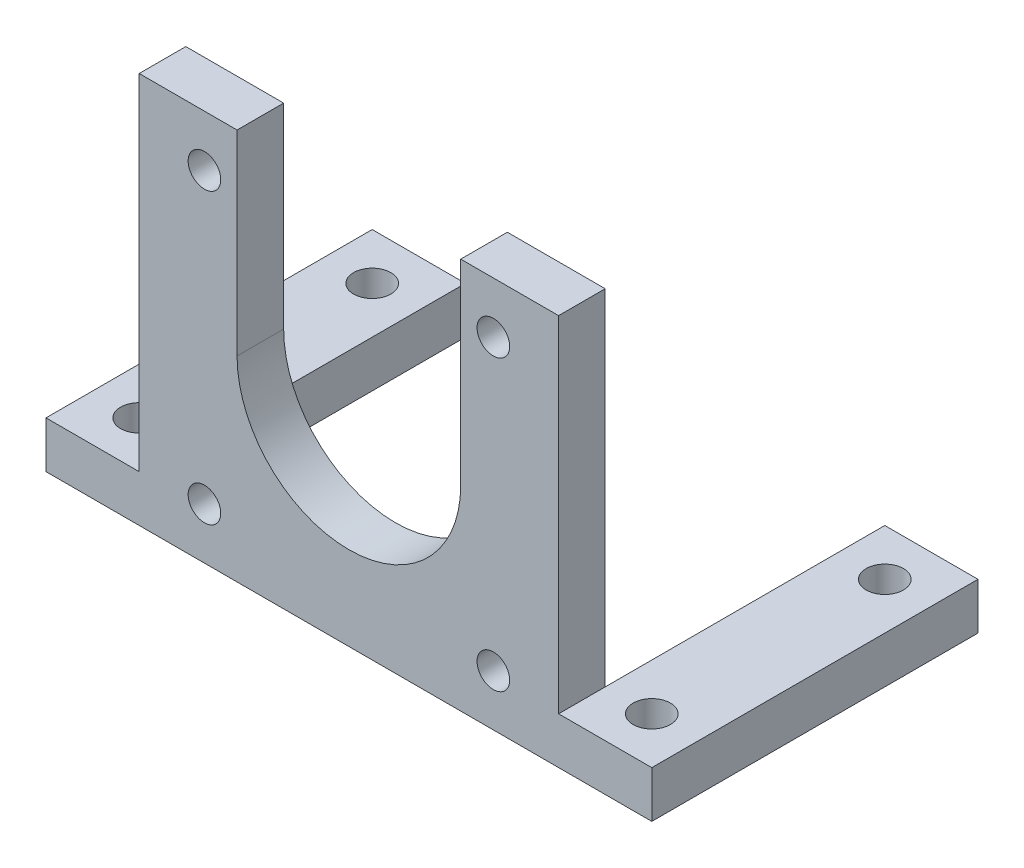
ISO-10303-21;
HEADER;
FILE_DESCRIPTION(('STEP AP214'),'2;1');
FILE_NAME('part.step','',(''),(''),'','','');
FILE_SCHEMA(('AUTOMOTIVE_DESIGN { 1 0 10303 214 1 1 1 1 }'));
ENDSEC;
DATA;
#1=APPLICATION_CONTEXT('core data for automotive mechanical design processes');
#2=APPLICATION_PROTOCOL_DEFINITION('international standard','automotive_design',2000,#1);
#3=PRODUCT_CONTEXT('',#1,'mechanical');
#4=PRODUCT('Part','Part','',(#3));
#5=PRODUCT_RELATED_PRODUCT_CATEGORY('part','',(#4));
#6=PRODUCT_DEFINITION_FORMATION('','',#4);
#7=PRODUCT_DEFINITION_CONTEXT('part definition',#1,'design');
#8=PRODUCT_DEFINITION('design','',#6,#7);
#9=PRODUCT_DEFINITION_SHAPE('','',#8);
#10=(LENGTH_UNIT() NAMED_UNIT(*) SI_UNIT(.MILLI.,.METRE.));
#11=(NAMED_UNIT(*) PLANE_ANGLE_UNIT() SI_UNIT($,.RADIAN.));
#12=(NAMED_UNIT(*) SI_UNIT($,.STERADIAN.) SOLID_ANGLE_UNIT());
#13=UNCERTAINTY_MEASURE_WITH_UNIT(LENGTH_MEASURE(1.E-05),#10,'distance_accuracy_value','');
#14=(GEOMETRIC_REPRESENTATION_CONTEXT(3) GLOBAL_UNCERTAINTY_ASSIGNED_CONTEXT((#13)) GLOBAL_UNIT_ASSIGNED_CONTEXT((#10,
#11,#12)) REPRESENTATION_CONTEXT('',''));
#15=CARTESIAN_POINT('',(0.,0.,0.));
#16=DIRECTION('',(0.,0.,1.));
#17=DIRECTION('',(1.,0.,0.));
#18=AXIS2_PLACEMENT_3D('',#15,#16,#17);
#19=CARTESIAN_POINT('',(0.,0.,5.));
#20=DIRECTION('',(0.,0.,1.));
#21=DIRECTION('',(1.,0.,0.));
#22=AXIS2_PLACEMENT_3D('',#19,#20,#21);
#23=PLANE('',#22);
#24=CARTESIAN_POINT('',(15.5,-15.5,5.));
#25=DIRECTION('',(0.,0.,1.));
#26=DIRECTION('',(1.,0.,0.));
#27=AXIS2_PLACEMENT_3D('',#24,#25,#26);
#28=CIRCLE('',#27,1.75);
#29=CARTESIAN_POINT('',(17.25,-15.5,5.));
#30=VERTEX_POINT('',#29);
#31=EDGE_CURVE('E225',#30,#30,#28,.T.);
#32=ORIENTED_EDGE('',*,*,#31,.F.);
#33=EDGE_LOOP('',(#32));
#34=FACE_BOUND('',#33,.T.);
#35=CARTESIAN_POINT('',(-15.5,15.5,5.));
#36=DIRECTION('',(0.,0.,1.));
#37=DIRECTION('',(1.,0.,0.));
#38=AXIS2_PLACEMENT_3D('',#35,#36,#37);
#39=CIRCLE('',#38,1.75);
#40=CARTESIAN_POINT('',(-13.75,15.5,5.));
#41=VERTEX_POINT('',#40);
#42=EDGE_CURVE('E237',#41,#41,#39,.T.);
#43=ORIENTED_EDGE('',*,*,#42,.F.);
#44=EDGE_LOOP('',(#43));
#45=FACE_BOUND('',#44,.T.);
#46=DIRECTION('',(1.,0.,0.));
#47=VECTOR('',#46,1.);
#48=CARTESIAN_POINT('',(-22.5,-21.,5.));
#49=LINE('',#48,#47);
#50=CARTESIAN_POINT('',(-32.5,-21.,5.));
#51=VERTEX_POINT('',#50);
#52=CARTESIAN_POINT('',(32.5,-21.,4.99999999999999));
#53=VERTEX_POINT('',#52);
#54=EDGE_CURVE('E259',#51,#53,#49,.T.);
#55=ORIENTED_EDGE('',*,*,#54,.T.);
#56=DIRECTION('',(0.,-1.,0.));
#57=VECTOR('',#56,1.);
#58=CARTESIAN_POINT('',(32.5,-16.,4.99999999999999));
#59=LINE('',#58,#57);
#60=CARTESIAN_POINT('',(32.5,-16.,4.99999999999999));
#61=VERTEX_POINT('',#60);
#62=EDGE_CURVE('E154',#61,#53,#59,.T.);
#63=ORIENTED_EDGE('',*,*,#62,.F.);
#64=DIRECTION('',(-1.,0.,0.));
#65=VECTOR('',#64,1.);
#66=CARTESIAN_POINT('',(32.5,-16.,4.99999999999999));
#67=LINE('',#66,#65);
#68=CARTESIAN_POINT('',(22.5,-16.,4.99999999999999));
#69=VERTEX_POINT('',#68);
#70=EDGE_CURVE('E160',#61,#69,#67,.T.);
#71=ORIENTED_EDGE('',*,*,#70,.T.);
#72=DIRECTION('',(0.,1.,0.));
#73=VECTOR('',#72,1.);
#74=CARTESIAN_POINT('',(22.5,21.,5.));
#75=LINE('',#74,#73);
#76=CARTESIAN_POINT('',(22.5,21.,5.));
#77=VERTEX_POINT('',#76);
#78=EDGE_CURVE('E243',#69,#77,#75,.T.);
#79=ORIENTED_EDGE('',*,*,#78,.T.);
#80=DIRECTION('',(-1.,0.,0.));
#81=VECTOR('',#80,1.);
#82=CARTESIAN_POINT('',(12.,21.,5.));
#83=LINE('',#82,#81);
#84=CARTESIAN_POINT('',(12.,21.,5.));
#85=VERTEX_POINT('',#84);
#86=EDGE_CURVE('E245',#77,#85,#83,.T.);
#87=ORIENTED_EDGE('',*,*,#86,.T.);
#88=DIRECTION('',(0.,-1.,0.));
#89=VECTOR('',#88,1.);
#90=CARTESIAN_POINT('',(12.,0.,5.));
#91=LINE('',#90,#89);
#92=CARTESIAN_POINT('',(12.,0.,5.));
#93=VERTEX_POINT('',#92);
#94=EDGE_CURVE('E248',#85,#93,#91,.T.);
#95=ORIENTED_EDGE('',*,*,#94,.T.);
#96=CARTESIAN_POINT('',(0.,0.,5.));
#97=DIRECTION('',(0.,0.,-1.));
#98=DIRECTION('',(1.,0.,0.));
#99=AXIS2_PLACEMENT_3D('',#96,#97,#98);
#100=CIRCLE('',#99,12.);
#101=CARTESIAN_POINT('',(-12.,0.,5.));
#102=VERTEX_POINT('',#101);
#103=EDGE_CURVE('E250',#93,#102,#100,.T.);
#104=ORIENTED_EDGE('',*,*,#103,.T.);
#105=DIRECTION('',(0.,1.,0.));
#106=VECTOR('',#105,1.);
#107=CARTESIAN_POINT('',(-12.,0.,5.));
#108=LINE('',#107,#106);
#109=CARTESIAN_POINT('',(-12.,21.,5.));
#110=VERTEX_POINT('',#109);
#111=EDGE_CURVE('E252',#102,#110,#108,.T.);
#112=ORIENTED_EDGE('',*,*,#111,.T.);
#113=DIRECTION('',(-1.,0.,0.));
#114=VECTOR('',#113,1.);
#115=CARTESIAN_POINT('',(-22.5,21.,5.));
#116=LINE('',#115,#114);
#117=CARTESIAN_POINT('',(-22.5,21.,5.));
#118=VERTEX_POINT('',#117);
#119=EDGE_CURVE('E254',#110,#118,#116,.T.);
#120=ORIENTED_EDGE('',*,*,#119,.T.);
#121=DIRECTION('',(0.,-1.,0.));
#122=VECTOR('',#121,1.);
#123=CARTESIAN_POINT('',(-22.5,21.,5.));
#124=LINE('',#123,#122);
#125=CARTESIAN_POINT('',(-22.5,-16.,5.));
#126=VERTEX_POINT('',#125);
#127=EDGE_CURVE('E256',#118,#126,#124,.T.);
#128=ORIENTED_EDGE('',*,*,#127,.T.);
#129=DIRECTION('',(-1.,0.,0.));
#130=VECTOR('',#129,1.);
#131=CARTESIAN_POINT('',(-32.5,-16.,5.));
#132=LINE('',#131,#130);
#133=CARTESIAN_POINT('',(-32.5,-16.,5.));
#134=VERTEX_POINT('',#133);
#135=EDGE_CURVE('E58',#126,#134,#132,.T.);
#136=ORIENTED_EDGE('',*,*,#135,.T.);
#137=DIRECTION('',(0.,-1.,0.));
#138=VECTOR('',#137,1.);
#139=CARTESIAN_POINT('',(-32.5,-16.,5.));
#140=LINE('',#139,#138);
#141=EDGE_CURVE('E212',#134,#51,#140,.T.);
#142=ORIENTED_EDGE('',*,*,#141,.T.);
#143=EDGE_LOOP('',(#55,#63,#71,#79,#87,#95,#104,#112,#120,#128,#136,#142));
#144=FACE_BOUND('',#143,.T.);
#145=CARTESIAN_POINT('',(15.5,15.5,5.));
#146=DIRECTION('',(0.,0.,1.));
#147=DIRECTION('',(1.,0.,0.));
#148=AXIS2_PLACEMENT_3D('',#145,#146,#147);
#149=CIRCLE('',#148,1.75);
#150=CARTESIAN_POINT('',(17.25,15.5,5.));
#151=VERTEX_POINT('',#150);
#152=EDGE_CURVE('E231',#151,#151,#149,.T.);
#153=ORIENTED_EDGE('',*,*,#152,.F.);
#154=EDGE_LOOP('',(#153));
#155=FACE_BOUND('',#154,.T.);
#156=CARTESIAN_POINT('',(-15.5,-15.5,5.));
#157=DIRECTION('',(0.,0.,1.));
#158=DIRECTION('',(1.,0.,0.));
#159=AXIS2_PLACEMENT_3D('',#156,#157,#158);
#160=CIRCLE('',#159,1.75);
#161=CARTESIAN_POINT('',(-13.75,-15.5,5.));
#162=VERTEX_POINT('',#161);
#163=EDGE_CURVE('E219',#162,#162,#160,.T.);
#164=ORIENTED_EDGE('',*,*,#163,.F.);
#165=EDGE_LOOP('',(#164));
#166=FACE_BOUND('',#165,.T.);
#167=ADVANCED_FACE('F33',(#34,#45,#144,#155,#166),#23,.T.);
#168=CARTESIAN_POINT('',(0.,0.,0.));
#169=DIRECTION('',(0.,0.,1.));
#170=DIRECTION('',(1.,0.,0.));
#171=AXIS2_PLACEMENT_3D('',#168,#169,#170);
#172=PLANE('',#171);
#173=DIRECTION('',(0.,1.,0.));
#174=VECTOR('',#173,1.);
#175=CARTESIAN_POINT('',(22.5,21.,0.));
#176=LINE('',#175,#174);
#177=CARTESIAN_POINT('',(22.5,-21.,0.));
#178=VERTEX_POINT('',#177);
#179=CARTESIAN_POINT('',(22.5,-16.,0.));
#180=VERTEX_POINT('',#179);
#181=EDGE_CURVE('E262',#178,#180,#176,.T.);
#182=ORIENTED_EDGE('',*,*,#181,.F.);
#183=DIRECTION('',(1.,0.,0.));
#184=VECTOR('',#183,1.);
#185=CARTESIAN_POINT('',(-22.5,-21.,0.));
#186=LINE('',#185,#184);
#187=CARTESIAN_POINT('',(-22.5,-21.,0.));
#188=VERTEX_POINT('',#187);
#189=EDGE_CURVE('E246',#188,#178,#186,.T.);
#190=ORIENTED_EDGE('',*,*,#189,.F.);
#191=DIRECTION('',(0.,-1.,0.));
#192=VECTOR('',#191,1.);
#193=CARTESIAN_POINT('',(-22.5,21.,0.));
#194=LINE('',#193,#192);
#195=CARTESIAN_POINT('',(-22.5,-16.,0.));
#196=VERTEX_POINT('',#195);
#197=EDGE_CURVE('E274',#196,#188,#194,.T.);
#198=ORIENTED_EDGE('',*,*,#197,.F.);
#199=CARTESIAN_POINT('',(-22.5,21.,0.));
#200=VERTEX_POINT('',#199);
#201=EDGE_CURVE('E275',#200,#196,#194,.T.);
#202=ORIENTED_EDGE('',*,*,#201,.F.);
#203=DIRECTION('',(-1.,0.,0.));
#204=VECTOR('',#203,1.);
#205=CARTESIAN_POINT('',(-22.5,21.,0.));
#206=LINE('',#205,#204);
#207=CARTESIAN_POINT('',(-12.,21.,0.));
#208=VERTEX_POINT('',#207);
#209=EDGE_CURVE('E272',#208,#200,#206,.T.);
#210=ORIENTED_EDGE('',*,*,#209,.F.);
#211=DIRECTION('',(0.,1.,0.));
#212=VECTOR('',#211,1.);
#213=CARTESIAN_POINT('',(-12.,0.,0.));
#214=LINE('',#213,#212);
#215=CARTESIAN_POINT('',(-12.,0.,0.));
#216=VERTEX_POINT('',#215);
#217=EDGE_CURVE('E270',#216,#208,#214,.T.);
#218=ORIENTED_EDGE('',*,*,#217,.F.);
#219=CARTESIAN_POINT('',(0.,0.,0.));
#220=DIRECTION('',(0.,0.,-1.));
#221=DIRECTION('',(1.,0.,0.));
#222=AXIS2_PLACEMENT_3D('',#219,#220,#221);
#223=CIRCLE('',#222,12.);
#224=CARTESIAN_POINT('',(12.,0.,0.));
#225=VERTEX_POINT('',#224);
#226=EDGE_CURVE('E268',#225,#216,#223,.T.);
#227=ORIENTED_EDGE('',*,*,#226,.F.);
#228=DIRECTION('',(0.,-1.,0.));
#229=VECTOR('',#228,1.);
#230=CARTESIAN_POINT('',(12.,0.,0.));
#231=LINE('',#230,#229);
#232=CARTESIAN_POINT('',(12.,21.,0.));
#233=VERTEX_POINT('',#232);
#234=EDGE_CURVE('E266',#233,#225,#231,.T.);
#235=ORIENTED_EDGE('',*,*,#234,.F.);
#236=DIRECTION('',(-1.,0.,0.));
#237=VECTOR('',#236,1.);
#238=CARTESIAN_POINT('',(12.,21.,0.));
#239=LINE('',#238,#237);
#240=CARTESIAN_POINT('',(22.5,21.,0.));
#241=VERTEX_POINT('',#240);
#242=EDGE_CURVE('E264',#241,#233,#239,.T.);
#243=ORIENTED_EDGE('',*,*,#242,.F.);
#244=EDGE_CURVE('E240',#180,#241,#176,.T.);
#245=ORIENTED_EDGE('',*,*,#244,.F.);
#246=EDGE_LOOP('',(#182,#190,#198,#202,#210,#218,#227,#235,#243,#245));
#247=FACE_BOUND('',#246,.T.);
#248=CARTESIAN_POINT('',(-15.5,15.5,0.));
#249=DIRECTION('',(0.,0.,1.));
#250=DIRECTION('',(1.,0.,0.));
#251=AXIS2_PLACEMENT_3D('',#248,#249,#250);
#252=CIRCLE('',#251,1.75);
#253=CARTESIAN_POINT('',(-13.75,15.5,0.));
#254=VERTEX_POINT('',#253);
#255=EDGE_CURVE('E234',#254,#254,#252,.T.);
#256=ORIENTED_EDGE('',*,*,#255,.T.);
#257=EDGE_LOOP('',(#256));
#258=FACE_BOUND('',#257,.T.);
#259=CARTESIAN_POINT('',(15.5,15.5,0.));
#260=DIRECTION('',(0.,0.,1.));
#261=DIRECTION('',(1.,0.,0.));
#262=AXIS2_PLACEMENT_3D('',#259,#260,#261);
#263=CIRCLE('',#262,1.75);
#264=CARTESIAN_POINT('',(17.25,15.5,0.));
#265=VERTEX_POINT('',#264);
#266=EDGE_CURVE('E228',#265,#265,#263,.T.);
#267=ORIENTED_EDGE('',*,*,#266,.T.);
#268=EDGE_LOOP('',(#267));
#269=FACE_BOUND('',#268,.T.);
#270=CARTESIAN_POINT('',(15.5,-15.5,0.));
#271=DIRECTION('',(0.,0.,1.));
#272=DIRECTION('',(1.,0.,0.));
#273=AXIS2_PLACEMENT_3D('',#270,#271,#272);
#274=CIRCLE('',#273,1.75);
#275=CARTESIAN_POINT('',(17.25,-15.5,0.));
#276=VERTEX_POINT('',#275);
#277=EDGE_CURVE('E222',#276,#276,#274,.T.);
#278=ORIENTED_EDGE('',*,*,#277,.T.);
#279=EDGE_LOOP('',(#278));
#280=FACE_BOUND('',#279,.T.);
#281=CARTESIAN_POINT('',(-15.5,-15.5,0.));
#282=DIRECTION('',(0.,0.,1.));
#283=DIRECTION('',(1.,0.,0.));
#284=AXIS2_PLACEMENT_3D('',#281,#282,#283);
#285=CIRCLE('',#284,1.75);
#286=CARTESIAN_POINT('',(-13.75,-15.5,0.));
#287=VERTEX_POINT('',#286);
#288=EDGE_CURVE('E215',#287,#287,#285,.T.);
#289=ORIENTED_EDGE('',*,*,#288,.T.);
#290=EDGE_LOOP('',(#289));
#291=FACE_BOUND('',#290,.T.);
#292=ADVANCED_FACE('F307',(#247,#258,#269,#280,#291),#172,.F.);
#293=CARTESIAN_POINT('',(22.5,21.,5.));
#294=DIRECTION('',(-1.,0.,0.));
#295=DIRECTION('',(0.,-1.,0.));
#296=AXIS2_PLACEMENT_3D('',#293,#294,#295);
#297=PLANE('',#296);
#298=ORIENTED_EDGE('',*,*,#78,.F.);
#299=DIRECTION('',(0.,0.,-1.));
#300=VECTOR('',#299,1.);
#301=CARTESIAN_POINT('',(22.5,-16.,4.99999999999999));
#302=LINE('',#301,#300);
#303=EDGE_CURVE('E155',#69,#180,#302,.T.);
#304=ORIENTED_EDGE('',*,*,#303,.T.);
#305=ORIENTED_EDGE('',*,*,#244,.T.);
#306=DIRECTION('',(0.,0.,-1.));
#307=VECTOR('',#306,1.);
#308=CARTESIAN_POINT('',(22.5,21.,5.));
#309=LINE('',#308,#307);
#310=EDGE_CURVE('E37',#77,#241,#309,.T.);
#311=ORIENTED_EDGE('',*,*,#310,.F.);
#312=EDGE_LOOP('',(#298,#304,#305,#311));
#313=FACE_BOUND('',#312,.T.);
#314=ADVANCED_FACE('F35',(#313),#297,.F.);
#315=CARTESIAN_POINT('',(12.,21.,5.));
#316=DIRECTION('',(0.,-1.,0.));
#317=DIRECTION('',(0.,0.,-1.));
#318=AXIS2_PLACEMENT_3D('',#315,#316,#317);
#319=PLANE('',#318);
#320=ORIENTED_EDGE('',*,*,#242,.T.);
#321=DIRECTION('',(0.,0.,-1.));
#322=VECTOR('',#321,1.);
#323=CARTESIAN_POINT('',(12.,21.,5.));
#324=LINE('',#323,#322);
#325=EDGE_CURVE('E290',#85,#233,#324,.T.);
#326=ORIENTED_EDGE('',*,*,#325,.F.);
#327=ORIENTED_EDGE('',*,*,#86,.F.);
#328=ORIENTED_EDGE('',*,*,#310,.T.);
#329=EDGE_LOOP('',(#320,#326,#327,#328));
#330=FACE_BOUND('',#329,.T.);
#331=ADVANCED_FACE('F300',(#330),#319,.F.);
#332=CARTESIAN_POINT('',(12.,0.,5.));
#333=DIRECTION('',(1.,0.,0.));
#334=DIRECTION('',(0.,1.,0.));
#335=AXIS2_PLACEMENT_3D('',#332,#333,#334);
#336=PLANE('',#335);
#337=ORIENTED_EDGE('',*,*,#234,.T.);
#338=DIRECTION('',(0.,0.,-1.));
#339=VECTOR('',#338,1.);
#340=CARTESIAN_POINT('',(12.,0.,5.));
#341=LINE('',#340,#339);
#342=EDGE_CURVE('E288',#93,#225,#341,.T.);
#343=ORIENTED_EDGE('',*,*,#342,.F.);
#344=ORIENTED_EDGE('',*,*,#94,.F.);
#345=ORIENTED_EDGE('',*,*,#325,.T.);
#346=EDGE_LOOP('',(#337,#343,#344,#345));
#347=FACE_BOUND('',#346,.T.);
#348=ADVANCED_FACE('F312',(#347),#336,.F.);
#349=CARTESIAN_POINT('',(0.,0.,5.));
#350=DIRECTION('',(0.,0.,-1.));
#351=DIRECTION('',(-1.,0.,0.));
#352=AXIS2_PLACEMENT_3D('',#349,#350,#351);
#353=CYLINDRICAL_SURFACE('',#352,12.);
#354=ORIENTED_EDGE('',*,*,#226,.T.);
#355=DIRECTION('',(0.,0.,-1.));
#356=VECTOR('',#355,1.);
#357=CARTESIAN_POINT('',(-12.,0.,5.));
#358=LINE('',#357,#356);
#359=EDGE_CURVE('E285',#102,#216,#358,.T.);
#360=ORIENTED_EDGE('',*,*,#359,.F.);
#361=ORIENTED_EDGE('',*,*,#103,.F.);
#362=ORIENTED_EDGE('',*,*,#342,.T.);
#363=EDGE_LOOP('',(#354,#360,#361,#362));
#364=FACE_BOUND('',#363,.T.);
#365=ADVANCED_FACE('F315',(#364),#353,.F.);
#366=CARTESIAN_POINT('',(-12.,0.,5.));
#367=DIRECTION('',(-1.,0.,0.));
#368=DIRECTION('',(0.,-1.,0.));
#369=AXIS2_PLACEMENT_3D('',#366,#367,#368);
#370=PLANE('',#369);
#371=ORIENTED_EDGE('',*,*,#217,.T.);
#372=DIRECTION('',(0.,0.,-1.));
#373=VECTOR('',#372,1.);
#374=CARTESIAN_POINT('',(-12.,21.,5.));
#375=LINE('',#374,#373);
#376=EDGE_CURVE('E282',#110,#208,#375,.T.);
#377=ORIENTED_EDGE('',*,*,#376,.F.);
#378=ORIENTED_EDGE('',*,*,#111,.F.);
#379=ORIENTED_EDGE('',*,*,#359,.T.);
#380=EDGE_LOOP('',(#371,#377,#378,#379));
#381=FACE_BOUND('',#380,.T.);
#382=ADVANCED_FACE('F340',(#381),#370,.F.);
#383=CARTESIAN_POINT('',(-22.5,21.,5.));
#384=DIRECTION('',(0.,-1.,0.));
#385=DIRECTION('',(0.,0.,-1.));
#386=AXIS2_PLACEMENT_3D('',#383,#384,#385);
#387=PLANE('',#386);
#388=ORIENTED_EDGE('',*,*,#209,.T.);
#389=DIRECTION('',(0.,0.,-1.));
#390=VECTOR('',#389,1.);
#391=CARTESIAN_POINT('',(-22.5,21.,5.));
#392=LINE('',#391,#390);
#393=EDGE_CURVE('E261',#118,#200,#392,.T.);
#394=ORIENTED_EDGE('',*,*,#393,.F.);
#395=ORIENTED_EDGE('',*,*,#119,.F.);
#396=ORIENTED_EDGE('',*,*,#376,.T.);
#397=EDGE_LOOP('',(#388,#394,#395,#396));
#398=FACE_BOUND('',#397,.T.);
#399=ADVANCED_FACE('F338',(#398),#387,.F.);
#400=CARTESIAN_POINT('',(-22.5,21.,5.));
#401=DIRECTION('',(1.,0.,0.));
#402=DIRECTION('',(0.,1.,0.));
#403=AXIS2_PLACEMENT_3D('',#400,#401,#402);
#404=PLANE('',#403);
#405=ORIENTED_EDGE('',*,*,#201,.T.);
#406=DIRECTION('',(0.,0.,1.));
#407=VECTOR('',#406,1.);
#408=CARTESIAN_POINT('',(-22.5,-16.,5.));
#409=LINE('',#408,#407);
#410=EDGE_CURVE('E11',#196,#126,#409,.T.);
#411=ORIENTED_EDGE('',*,*,#410,.T.);
#412=ORIENTED_EDGE('',*,*,#127,.F.);
#413=ORIENTED_EDGE('',*,*,#393,.T.);
#414=EDGE_LOOP('',(#405,#411,#412,#413));
#415=FACE_BOUND('',#414,.T.);
#416=ADVANCED_FACE('F333',(#415),#404,.F.);
#417=CARTESIAN_POINT('',(-22.5,-21.,5.));
#418=DIRECTION('',(0.,1.,0.));
#419=DIRECTION('',(0.,0.,1.));
#420=AXIS2_PLACEMENT_3D('',#417,#418,#419);
#421=PLANE('',#420);
#422=ORIENTED_EDGE('',*,*,#189,.T.);
#423=DIRECTION('',(0.,0.,-1.));
#424=VECTOR('',#423,1.);
#425=CARTESIAN_POINT('',(22.5,-21.,4.99999999999999));
#426=LINE('',#425,#424);
#427=CARTESIAN_POINT('',(22.5,-21.,-30.));
#428=VERTEX_POINT('',#427);
#429=EDGE_CURVE('E166',#178,#428,#426,.T.);
#430=ORIENTED_EDGE('',*,*,#429,.T.);
#431=DIRECTION('',(1.,0.,0.));
#432=VECTOR('',#431,1.);
#433=CARTESIAN_POINT('',(22.5,-21.,-30.));
#434=LINE('',#433,#432);
#435=CARTESIAN_POINT('',(32.5,-21.,-30.));
#436=VERTEX_POINT('',#435);
#437=EDGE_CURVE('E176',#428,#436,#434,.T.);
#438=ORIENTED_EDGE('',*,*,#437,.T.);
#439=DIRECTION('',(0.,0.,1.));
#440=VECTOR('',#439,1.);
#441=CARTESIAN_POINT('',(32.5,-21.,-30.));
#442=LINE('',#441,#440);
#443=EDGE_CURVE('E149',#436,#53,#442,.T.);
#444=ORIENTED_EDGE('',*,*,#443,.T.);
#445=ORIENTED_EDGE('',*,*,#54,.F.);
#446=DIRECTION('',(0.,0.,-1.));
#447=VECTOR('',#446,1.);
#448=CARTESIAN_POINT('',(-32.5,-21.,-30.));
#449=LINE('',#448,#447);
#450=CARTESIAN_POINT('',(-32.5,-21.,-30.));
#451=VERTEX_POINT('',#450);
#452=EDGE_CURVE('E192',#51,#451,#449,.T.);
#453=ORIENTED_EDGE('',*,*,#452,.T.);
#454=DIRECTION('',(1.,0.,0.));
#455=VECTOR('',#454,1.);
#456=CARTESIAN_POINT('',(-22.5,-21.,-30.));
#457=LINE('',#456,#455);
#458=CARTESIAN_POINT('',(-22.5,-21.,-30.));
#459=VERTEX_POINT('',#458);
#460=EDGE_CURVE('E207',#451,#459,#457,.T.);
#461=ORIENTED_EDGE('',*,*,#460,.T.);
#462=DIRECTION('',(0.,0.,1.));
#463=VECTOR('',#462,1.);
#464=CARTESIAN_POINT('',(-22.5,-21.,5.));
#465=LINE('',#464,#463);
#466=EDGE_CURVE('E199',#459,#188,#465,.T.);
#467=ORIENTED_EDGE('',*,*,#466,.T.);
#468=EDGE_LOOP('',(#422,#430,#438,#444,#445,#453,#461,#467));
#469=FACE_BOUND('',#468,.T.);
#470=CARTESIAN_POINT('',(-27.5,-21.,0.));
#471=DIRECTION('',(0.,-1.,0.));
#472=DIRECTION('',(0.,0.,-1.));
#473=AXIS2_PLACEMENT_3D('',#470,#471,#472);
#474=CIRCLE('',#473,2.);
#475=CARTESIAN_POINT('',(-27.5,-21.,-2.));
#476=VERTEX_POINT('',#475);
#477=EDGE_CURVE('E181',#476,#476,#474,.T.);
#478=ORIENTED_EDGE('',*,*,#477,.F.);
#479=EDGE_LOOP('',(#478));
#480=FACE_BOUND('',#479,.T.);
#481=CARTESIAN_POINT('',(-27.5,-21.,-25.));
#482=DIRECTION('',(0.,-1.,0.));
#483=DIRECTION('',(0.,0.,-1.));
#484=AXIS2_PLACEMENT_3D('',#481,#482,#483);
#485=CIRCLE('',#484,2.00000000000001);
#486=CARTESIAN_POINT('',(-27.5,-21.,-27.));
#487=VERTEX_POINT('',#486);
#488=EDGE_CURVE('E186',#487,#487,#485,.T.);
#489=ORIENTED_EDGE('',*,*,#488,.F.);
#490=EDGE_LOOP('',(#489));
#491=FACE_BOUND('',#490,.T.);
#492=CARTESIAN_POINT('',(27.5,-21.,-25.));
#493=DIRECTION('',(0.,-1.,0.));
#494=DIRECTION('',(0.,0.,1.));
#495=AXIS2_PLACEMENT_3D('',#492,#493,#494);
#496=CIRCLE('',#495,2.00000000000001);
#497=CARTESIAN_POINT('',(27.5,-21.,-23.));
#498=VERTEX_POINT('',#497);
#499=EDGE_CURVE('E592',#498,#498,#496,.T.);
#500=ORIENTED_EDGE('',*,*,#499,.F.);
#501=EDGE_LOOP('',(#500));
#502=FACE_BOUND('',#501,.T.);
#503=CARTESIAN_POINT('',(27.5,-21.,0.));
#504=DIRECTION('',(0.,-1.,0.));
#505=DIRECTION('',(0.,0.,1.));
#506=AXIS2_PLACEMENT_3D('',#503,#504,#505);
#507=CIRCLE('',#506,2.);
#508=CARTESIAN_POINT('',(27.5,-21.,1.99999999999999));
#509=VERTEX_POINT('',#508);
#510=EDGE_CURVE('E170',#509,#509,#507,.T.);
#511=ORIENTED_EDGE('',*,*,#510,.F.);
#512=EDGE_LOOP('',(#511));
#513=FACE_BOUND('',#512,.T.);
#514=ADVANCED_FACE('F322',(#469,#480,#491,#502,#513),#421,.F.);
#515=CARTESIAN_POINT('',(-15.5,15.5,5.));
#516=DIRECTION('',(0.,0.,-1.));
#517=DIRECTION('',(-1.,0.,0.));
#518=AXIS2_PLACEMENT_3D('',#515,#516,#517);
#519=CYLINDRICAL_SURFACE('',#518,1.75);
#520=ORIENTED_EDGE('',*,*,#42,.T.);
#521=EDGE_LOOP('',(#520));
#522=FACE_BOUND('',#521,.T.);
#523=ORIENTED_EDGE('',*,*,#255,.F.);
#524=EDGE_LOOP('',(#523));
#525=FACE_BOUND('',#524,.T.);
#526=ADVANCED_FACE('F359',(#522,#525),#519,.F.);
#527=CARTESIAN_POINT('',(15.5,15.5,5.));
#528=DIRECTION('',(0.,0.,-1.));
#529=DIRECTION('',(-1.,0.,0.));
#530=AXIS2_PLACEMENT_3D('',#527,#528,#529);
#531=CYLINDRICAL_SURFACE('',#530,1.75);
#532=ORIENTED_EDGE('',*,*,#152,.T.);
#533=EDGE_LOOP('',(#532));
#534=FACE_BOUND('',#533,.T.);
#535=ORIENTED_EDGE('',*,*,#266,.F.);
#536=EDGE_LOOP('',(#535));
#537=FACE_BOUND('',#536,.T.);
#538=ADVANCED_FACE('F381',(#534,#537),#531,.F.);
#539=CARTESIAN_POINT('',(15.5,-15.5,5.));
#540=DIRECTION('',(0.,0.,-1.));
#541=DIRECTION('',(-1.,0.,0.));
#542=AXIS2_PLACEMENT_3D('',#539,#540,#541);
#543=CYLINDRICAL_SURFACE('',#542,1.75);
#544=ORIENTED_EDGE('',*,*,#31,.T.);
#545=EDGE_LOOP('',(#544));
#546=FACE_BOUND('',#545,.T.);
#547=ORIENTED_EDGE('',*,*,#277,.F.);
#548=EDGE_LOOP('',(#547));
#549=FACE_BOUND('',#548,.T.);
#550=ADVANCED_FACE('F388',(#546,#549),#543,.F.);
#551=CARTESIAN_POINT('',(-15.5,-15.5,5.));
#552=DIRECTION('',(0.,0.,-1.));
#553=DIRECTION('',(-1.,0.,0.));
#554=AXIS2_PLACEMENT_3D('',#551,#552,#553);
#555=CYLINDRICAL_SURFACE('',#554,1.75);
#556=ORIENTED_EDGE('',*,*,#163,.T.);
#557=EDGE_LOOP('',(#556));
#558=FACE_BOUND('',#557,.T.);
#559=ORIENTED_EDGE('',*,*,#288,.F.);
#560=EDGE_LOOP('',(#559));
#561=FACE_BOUND('',#560,.T.);
#562=ADVANCED_FACE('F395',(#558,#561),#555,.F.);
#563=CARTESIAN_POINT('',(-32.5,-16.,-30.));
#564=DIRECTION('',(-1.,0.,0.));
#565=DIRECTION('',(0.,0.,1.));
#566=AXIS2_PLACEMENT_3D('',#563,#564,#565);
#567=PLANE('',#566);
#568=ORIENTED_EDGE('',*,*,#452,.F.);
#569=ORIENTED_EDGE('',*,*,#141,.F.);
#570=DIRECTION('',(0.,0.,-1.));
#571=VECTOR('',#570,1.);
#572=CARTESIAN_POINT('',(-32.5,-16.,-30.));
#573=LINE('',#572,#571);
#574=CARTESIAN_POINT('',(-32.5,-16.,-30.));
#575=VERTEX_POINT('',#574);
#576=EDGE_CURVE('E195',#134,#575,#573,.T.);
#577=ORIENTED_EDGE('',*,*,#576,.T.);
#578=DIRECTION('',(0.,-1.,0.));
#579=VECTOR('',#578,1.);
#580=CARTESIAN_POINT('',(-32.5,-16.,-30.));
#581=LINE('',#580,#579);
#582=EDGE_CURVE('E204',#575,#451,#581,.T.);
#583=ORIENTED_EDGE('',*,*,#582,.T.);
#584=EDGE_LOOP('',(#568,#569,#577,#583));
#585=FACE_BOUND('',#584,.T.);
#586=ADVANCED_FACE('F403',(#585),#567,.T.);
#587=CARTESIAN_POINT('',(-22.5,-16.,5.));
#588=DIRECTION('',(1.,0.,0.));
#589=DIRECTION('',(0.,0.,-1.));
#590=AXIS2_PLACEMENT_3D('',#587,#588,#589);
#591=PLANE('',#590);
#592=CARTESIAN_POINT('',(-22.5,-16.,-30.));
#593=VERTEX_POINT('',#592);
#594=EDGE_CURVE('E43',#593,#196,#409,.T.);
#595=ORIENTED_EDGE('',*,*,#594,.T.);
#596=ORIENTED_EDGE('',*,*,#197,.T.);
#597=ORIENTED_EDGE('',*,*,#466,.F.);
#598=DIRECTION('',(0.,-1.,0.));
#599=VECTOR('',#598,1.);
#600=CARTESIAN_POINT('',(-22.5,-16.,-30.));
#601=LINE('',#600,#599);
#602=EDGE_CURVE('E216',#593,#459,#601,.T.);
#603=ORIENTED_EDGE('',*,*,#602,.F.);
#604=EDGE_LOOP('',(#595,#596,#597,#603));
#605=FACE_BOUND('',#604,.T.);
#606=ADVANCED_FACE('F410',(#605),#591,.T.);
#607=CARTESIAN_POINT('',(-22.5,-16.,-30.));
#608=DIRECTION('',(0.,0.,-1.));
#609=DIRECTION('',(-1.,0.,0.));
#610=AXIS2_PLACEMENT_3D('',#607,#608,#609);
#611=PLANE('',#610);
#612=ORIENTED_EDGE('',*,*,#460,.F.);
#613=ORIENTED_EDGE('',*,*,#582,.F.);
#614=DIRECTION('',(1.,0.,0.));
#615=VECTOR('',#614,1.);
#616=CARTESIAN_POINT('',(-22.5,-16.,-30.));
#617=LINE('',#616,#615);
#618=EDGE_CURVE('E198',#575,#593,#617,.T.);
#619=ORIENTED_EDGE('',*,*,#618,.T.);
#620=ORIENTED_EDGE('',*,*,#602,.T.);
#621=EDGE_LOOP('',(#612,#613,#619,#620));
#622=FACE_BOUND('',#621,.T.);
#623=ADVANCED_FACE('F418',(#622),#611,.T.);
#624=CARTESIAN_POINT('',(0.,-16.,0.));
#625=DIRECTION('',(0.,1.,0.));
#626=DIRECTION('',(0.,0.,1.));
#627=AXIS2_PLACEMENT_3D('',#624,#625,#626);
#628=PLANE('',#627);
#629=CARTESIAN_POINT('',(-27.5,-16.,0.));
#630=DIRECTION('',(0.,-1.,0.));
#631=DIRECTION('',(0.,0.,-1.));
#632=AXIS2_PLACEMENT_3D('',#629,#630,#631);
#633=CIRCLE('',#632,2.);
#634=CARTESIAN_POINT('',(-27.5,-16.,-2.));
#635=VERTEX_POINT('',#634);
#636=EDGE_CURVE('E183',#635,#635,#633,.T.);
#637=ORIENTED_EDGE('',*,*,#636,.T.);
#638=EDGE_LOOP('',(#637));
#639=FACE_BOUND('',#638,.T.);
#640=CARTESIAN_POINT('',(-27.5,-16.,-25.));
#641=DIRECTION('',(0.,-1.,0.));
#642=DIRECTION('',(0.,0.,-1.));
#643=AXIS2_PLACEMENT_3D('',#640,#641,#642);
#644=CIRCLE('',#643,2.00000000000001);
#645=CARTESIAN_POINT('',(-27.5,-16.,-27.));
#646=VERTEX_POINT('',#645);
#647=EDGE_CURVE('E189',#646,#646,#644,.T.);
#648=ORIENTED_EDGE('',*,*,#647,.T.);
#649=EDGE_LOOP('',(#648));
#650=FACE_BOUND('',#649,.T.);
#651=ORIENTED_EDGE('',*,*,#576,.F.);
#652=ORIENTED_EDGE('',*,*,#135,.F.);
#653=ORIENTED_EDGE('',*,*,#410,.F.);
#654=ORIENTED_EDGE('',*,*,#594,.F.);
#655=ORIENTED_EDGE('',*,*,#618,.F.);
#656=EDGE_LOOP('',(#651,#652,#653,#654,#655));
#657=FACE_BOUND('',#656,.T.);
#658=ADVANCED_FACE('F425',(#639,#650,#657),#628,.T.);
#659=CARTESIAN_POINT('',(-27.5,-16.,-25.));
#660=DIRECTION('',(0.,-1.,0.));
#661=DIRECTION('',(0.,0.,-1.));
#662=AXIS2_PLACEMENT_3D('',#659,#660,#661);
#663=CYLINDRICAL_SURFACE('',#662,2.00000000000001);
#664=ORIENTED_EDGE('',*,*,#647,.F.);
#665=EDGE_LOOP('',(#664));
#666=FACE_BOUND('',#665,.T.);
#667=ORIENTED_EDGE('',*,*,#488,.T.);
#668=EDGE_LOOP('',(#667));
#669=FACE_BOUND('',#668,.T.);
#670=ADVANCED_FACE('F433',(#666,#669),#663,.F.);
#671=CARTESIAN_POINT('',(-27.5,-16.,0.));
#672=DIRECTION('',(0.,-1.,0.));
#673=DIRECTION('',(0.,0.,-1.));
#674=AXIS2_PLACEMENT_3D('',#671,#672,#673);
#675=CYLINDRICAL_SURFACE('',#674,2.);
#676=ORIENTED_EDGE('',*,*,#636,.F.);
#677=EDGE_LOOP('',(#676));
#678=FACE_BOUND('',#677,.T.);
#679=ORIENTED_EDGE('',*,*,#477,.T.);
#680=EDGE_LOOP('',(#679));
#681=FACE_BOUND('',#680,.T.);
#682=ADVANCED_FACE('F441',(#678,#681),#675,.F.);
#683=CARTESIAN_POINT('',(22.5,-16.,-30.));
#684=DIRECTION('',(0.,0.,-1.));
#685=DIRECTION('',(-1.,0.,0.));
#686=AXIS2_PLACEMENT_3D('',#683,#684,#685);
#687=PLANE('',#686);
#688=ORIENTED_EDGE('',*,*,#437,.F.);
#689=DIRECTION('',(0.,-1.,0.));
#690=VECTOR('',#689,1.);
#691=CARTESIAN_POINT('',(22.5,-16.,-30.));
#692=LINE('',#691,#690);
#693=CARTESIAN_POINT('',(22.5,-16.,-30.));
#694=VERTEX_POINT('',#693);
#695=EDGE_CURVE('E165',#694,#428,#692,.T.);
#696=ORIENTED_EDGE('',*,*,#695,.F.);
#697=DIRECTION('',(1.,0.,0.));
#698=VECTOR('',#697,1.);
#699=CARTESIAN_POINT('',(22.5,-16.,-30.));
#700=LINE('',#699,#698);
#701=CARTESIAN_POINT('',(32.5,-16.,-30.));
#702=VERTEX_POINT('',#701);
#703=EDGE_CURVE('E159',#694,#702,#700,.T.);
#704=ORIENTED_EDGE('',*,*,#703,.T.);
#705=DIRECTION('',(0.,-1.,0.));
#706=VECTOR('',#705,1.);
#707=CARTESIAN_POINT('',(32.5,-16.,-30.));
#708=LINE('',#707,#706);
#709=EDGE_CURVE('E143',#702,#436,#708,.T.);
#710=ORIENTED_EDGE('',*,*,#709,.T.);
#711=EDGE_LOOP('',(#688,#696,#704,#710));
#712=FACE_BOUND('',#711,.T.);
#713=ADVANCED_FACE('F163',(#712),#687,.T.);
#714=CARTESIAN_POINT('',(22.5,-16.,4.99999999999999));
#715=DIRECTION('',(-1.,0.,0.));
#716=DIRECTION('',(0.,0.,1.));
#717=AXIS2_PLACEMENT_3D('',#714,#715,#716);
#718=PLANE('',#717);
#719=ORIENTED_EDGE('',*,*,#429,.F.);
#720=ORIENTED_EDGE('',*,*,#181,.T.);
#721=EDGE_CURVE('E50',#180,#694,#302,.T.);
#722=ORIENTED_EDGE('',*,*,#721,.T.);
#723=ORIENTED_EDGE('',*,*,#695,.T.);
#724=EDGE_LOOP('',(#719,#720,#722,#723));
#725=FACE_BOUND('',#724,.T.);
#726=ADVANCED_FACE('F326',(#725),#718,.T.);
#727=CARTESIAN_POINT('',(32.5,-16.,-30.));
#728=DIRECTION('',(1.,0.,0.));
#729=DIRECTION('',(0.,0.,-1.));
#730=AXIS2_PLACEMENT_3D('',#727,#728,#729);
#731=PLANE('',#730);
#732=ORIENTED_EDGE('',*,*,#443,.F.);
#733=ORIENTED_EDGE('',*,*,#709,.F.);
#734=DIRECTION('',(0.,0.,1.));
#735=VECTOR('',#734,1.);
#736=CARTESIAN_POINT('',(32.5,-16.,-30.));
#737=LINE('',#736,#735);
#738=EDGE_CURVE('E147',#702,#61,#737,.T.);
#739=ORIENTED_EDGE('',*,*,#738,.T.);
#740=ORIENTED_EDGE('',*,*,#62,.T.);
#741=EDGE_LOOP('',(#732,#733,#739,#740));
#742=FACE_BOUND('',#741,.T.);
#743=ADVANCED_FACE('F145',(#742),#731,.T.);
#744=CARTESIAN_POINT('',(0.,-16.,0.));
#745=DIRECTION('',(0.,-1.,0.));
#746=DIRECTION('',(0.,0.,-1.));
#747=AXIS2_PLACEMENT_3D('',#744,#745,#746);
#748=PLANE('',#747);
#749=CARTESIAN_POINT('',(27.5,-16.,-25.));
#750=DIRECTION('',(0.,-1.,0.));
#751=DIRECTION('',(0.,0.,1.));
#752=AXIS2_PLACEMENT_3D('',#749,#750,#751);
#753=CIRCLE('',#752,2.00000000000001);
#754=CARTESIAN_POINT('',(27.5,-16.,-23.));
#755=VERTEX_POINT('',#754);
#756=EDGE_CURVE('E589',#755,#755,#753,.T.);
#757=ORIENTED_EDGE('',*,*,#756,.T.);
#758=EDGE_LOOP('',(#757));
#759=FACE_BOUND('',#758,.T.);
#760=CARTESIAN_POINT('',(27.5,-16.,0.));
#761=DIRECTION('',(0.,-1.,0.));
#762=DIRECTION('',(0.,0.,1.));
#763=AXIS2_PLACEMENT_3D('',#760,#761,#762);
#764=CIRCLE('',#763,2.);
#765=CARTESIAN_POINT('',(27.5,-16.,1.99999999999999));
#766=VERTEX_POINT('',#765);
#767=EDGE_CURVE('E178',#766,#766,#764,.T.);
#768=ORIENTED_EDGE('',*,*,#767,.T.);
#769=EDGE_LOOP('',(#768));
#770=FACE_BOUND('',#769,.T.);
#771=ORIENTED_EDGE('',*,*,#703,.F.);
#772=ORIENTED_EDGE('',*,*,#721,.F.);
#773=ORIENTED_EDGE('',*,*,#303,.F.);
#774=ORIENTED_EDGE('',*,*,#70,.F.);
#775=ORIENTED_EDGE('',*,*,#738,.F.);
#776=EDGE_LOOP('',(#771,#772,#773,#774,#775));
#777=FACE_BOUND('',#776,.T.);
#778=ADVANCED_FACE('F158',(#759,#770,#777),#748,.F.);
#779=CARTESIAN_POINT('',(27.5,-16.,0.));
#780=DIRECTION('',(0.,-1.,0.));
#781=DIRECTION('',(0.,0.,-1.));
#782=AXIS2_PLACEMENT_3D('',#779,#780,#781);
#783=CYLINDRICAL_SURFACE('',#782,2.);
#784=ORIENTED_EDGE('',*,*,#767,.F.);
#785=EDGE_LOOP('',(#784));
#786=FACE_BOUND('',#785,.T.);
#787=ORIENTED_EDGE('',*,*,#510,.T.);
#788=EDGE_LOOP('',(#787));
#789=FACE_BOUND('',#788,.T.);
#790=ADVANCED_FACE('F474',(#786,#789),#783,.F.);
#791=CARTESIAN_POINT('',(27.5,-16.,-25.));
#792=DIRECTION('',(0.,-1.,0.));
#793=DIRECTION('',(0.,0.,-1.));
#794=AXIS2_PLACEMENT_3D('',#791,#792,#793);
#795=CYLINDRICAL_SURFACE('',#794,2.00000000000001);
#796=ORIENTED_EDGE('',*,*,#756,.F.);
#797=EDGE_LOOP('',(#796));
#798=FACE_BOUND('',#797,.T.);
#799=ORIENTED_EDGE('',*,*,#499,.T.);
#800=EDGE_LOOP('',(#799));
#801=FACE_BOUND('',#800,.T.);
#802=ADVANCED_FACE('F482',(#798,#801),#795,.F.);
#803=CLOSED_SHELL('',(#167,#292,#314,#331,#348,#365,#382,#399,#416,#514,#526,#538,#550,#562,
#586,#606,#623,#658,#670,#682,#713,#726,#743,#778,#790,#802));
#804=MANIFOLD_SOLID_BREP('B2',#803);
#805=ADVANCED_BREP_SHAPE_REPRESENTATION('',(#18,#804),#14);
#806=SHAPE_DEFINITION_REPRESENTATION(#9,#805);
ENDSEC;
END-ISO-10303-21;
